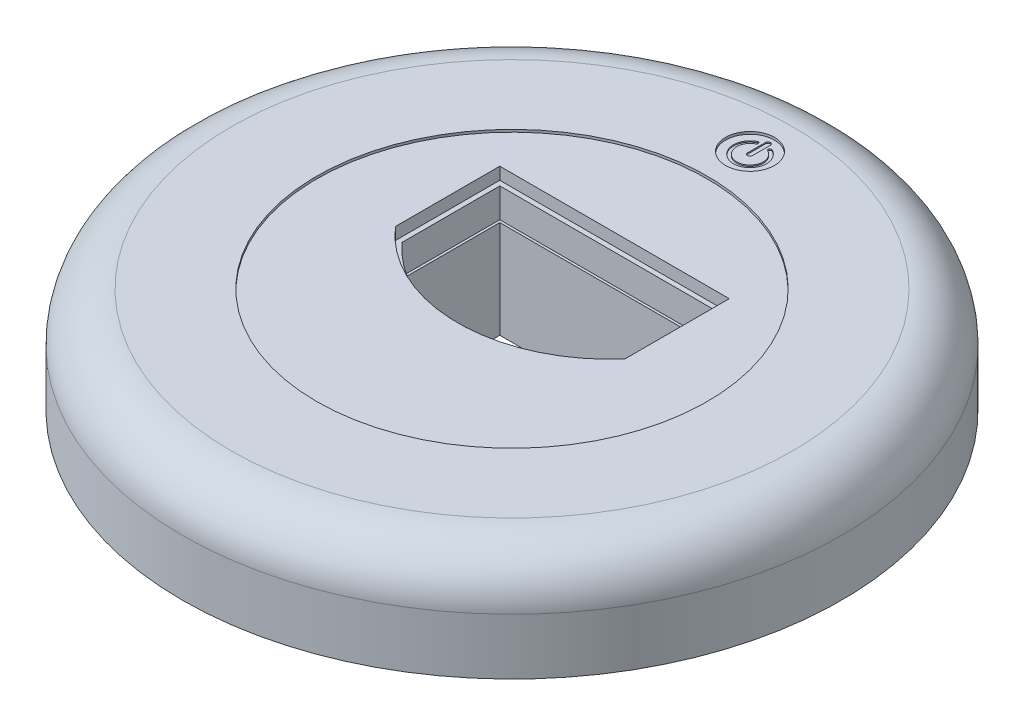
ISO-10303-21;
HEADER;
FILE_DESCRIPTION(('STEP AP214'),'2;1');
FILE_NAME('part.step','',(''),(''),'','','');
FILE_SCHEMA(('AUTOMOTIVE_DESIGN { 1 0 10303 214 1 1 1 1 }'));
ENDSEC;
DATA;
#1=APPLICATION_CONTEXT('core data for automotive mechanical design processes');
#2=APPLICATION_PROTOCOL_DEFINITION('international standard','automotive_design',2000,#1);
#3=PRODUCT_CONTEXT('',#1,'mechanical');
#4=PRODUCT('Part','Part','',(#3));
#5=PRODUCT_RELATED_PRODUCT_CATEGORY('part','',(#4));
#6=PRODUCT_DEFINITION_FORMATION('','',#4);
#7=PRODUCT_DEFINITION_CONTEXT('part definition',#1,'design');
#8=PRODUCT_DEFINITION('design','',#6,#7);
#9=PRODUCT_DEFINITION_SHAPE('','',#8);
#10=(LENGTH_UNIT() NAMED_UNIT(*) SI_UNIT(.MILLI.,.METRE.));
#11=(NAMED_UNIT(*) PLANE_ANGLE_UNIT() SI_UNIT($,.RADIAN.));
#12=(NAMED_UNIT(*) SI_UNIT($,.STERADIAN.) SOLID_ANGLE_UNIT());
#13=UNCERTAINTY_MEASURE_WITH_UNIT(LENGTH_MEASURE(1.E-05),#10,'distance_accuracy_value','');
#14=(GEOMETRIC_REPRESENTATION_CONTEXT(3) GLOBAL_UNCERTAINTY_ASSIGNED_CONTEXT((#13)) GLOBAL_UNIT_ASSIGNED_CONTEXT((#10,
#11,#12)) REPRESENTATION_CONTEXT('',''));
#15=CARTESIAN_POINT('',(0.,0.,0.));
#16=DIRECTION('',(0.,0.,1.));
#17=DIRECTION('',(1.,0.,0.));
#18=AXIS2_PLACEMENT_3D('',#15,#16,#17);
#19=CARTESIAN_POINT('',(-45.,-25.,0.));
#20=DIRECTION('',(1.,0.,0.));
#21=DIRECTION('',(0.,0.,-1.));
#22=AXIS2_PLACEMENT_3D('',#19,#20,#21);
#23=PLANE('',#22);
#24=DIRECTION('',(0.,1.,0.));
#25=VECTOR('',#24,1.);
#26=CARTESIAN_POINT('',(-45.,-25.,-40.));
#27=LINE('',#26,#25);
#28=CARTESIAN_POINT('',(-45.,25.,-40.));
#29=VERTEX_POINT('',#28);
#30=CARTESIAN_POINT('',(-45.,37.,-40.));
#31=VERTEX_POINT('',#30);
#32=EDGE_CURVE('E289',#29,#31,#27,.T.);
#33=ORIENTED_EDGE('',*,*,#32,.T.);
#34=DIRECTION('',(0.,0.,1.));
#35=VECTOR('',#34,1.);
#36=CARTESIAN_POINT('',(-45.,37.,-40.));
#37=LINE('',#36,#35);
#38=CARTESIAN_POINT('',(-45.,37.,0.));
#39=VERTEX_POINT('',#38);
#40=EDGE_CURVE('E271',#31,#39,#37,.T.);
#41=ORIENTED_EDGE('',*,*,#40,.T.);
#42=DIRECTION('',(0.,1.,0.));
#43=VECTOR('',#42,1.);
#44=CARTESIAN_POINT('',(-45.,-25.,0.));
#45=LINE('',#44,#43);
#46=CARTESIAN_POINT('',(-45.,25.,0.));
#47=VERTEX_POINT('',#46);
#48=EDGE_CURVE('E293',#47,#39,#45,.T.);
#49=ORIENTED_EDGE('',*,*,#48,.F.);
#50=DIRECTION('',(0.,0.,-1.));
#51=VECTOR('',#50,1.);
#52=CARTESIAN_POINT('',(-45.,25.,-40.));
#53=LINE('',#52,#51);
#54=EDGE_CURVE('E936',#47,#29,#53,.T.);
#55=ORIENTED_EDGE('',*,*,#54,.T.);
#56=EDGE_LOOP('',(#33,#41,#49,#55));
#57=FACE_BOUND('',#56,.T.);
#58=ADVANCED_FACE('F84',(#57),#23,.T.);
#59=CARTESIAN_POINT('',(0.,-25.,-40.));
#60=DIRECTION('',(0.,0.,1.));
#61=DIRECTION('',(1.,0.,0.));
#62=AXIS2_PLACEMENT_3D('',#59,#60,#61);
#63=PLANE('',#62);
#64=DIRECTION('',(0.,1.,0.));
#65=VECTOR('',#64,1.);
#66=CARTESIAN_POINT('',(45.,-25.,-40.));
#67=LINE('',#66,#65);
#68=CARTESIAN_POINT('',(45.,25.,-40.));
#69=VERTEX_POINT('',#68);
#70=CARTESIAN_POINT('',(45.,37.,-40.));
#71=VERTEX_POINT('',#70);
#72=EDGE_CURVE('E282',#69,#71,#67,.T.);
#73=ORIENTED_EDGE('',*,*,#72,.T.);
#74=DIRECTION('',(-1.,0.,0.));
#75=VECTOR('',#74,1.);
#76=CARTESIAN_POINT('',(45.,37.,-40.));
#77=LINE('',#76,#75);
#78=EDGE_CURVE('E267',#71,#31,#77,.T.);
#79=ORIENTED_EDGE('',*,*,#78,.T.);
#80=ORIENTED_EDGE('',*,*,#32,.F.);
#81=DIRECTION('',(1.,0.,0.));
#82=VECTOR('',#81,1.);
#83=CARTESIAN_POINT('',(45.,25.,-40.));
#84=LINE('',#83,#82);
#85=EDGE_CURVE('E288',#29,#69,#84,.T.);
#86=ORIENTED_EDGE('',*,*,#85,.T.);
#87=EDGE_LOOP('',(#73,#79,#80,#86));
#88=FACE_BOUND('',#87,.T.);
#89=ADVANCED_FACE('F286',(#88),#63,.T.);
#90=CARTESIAN_POINT('',(45.,-25.,0.));
#91=DIRECTION('',(-1.,0.,0.));
#92=DIRECTION('',(0.,0.,1.));
#93=AXIS2_PLACEMENT_3D('',#90,#91,#92);
#94=PLANE('',#93);
#95=DIRECTION('',(0.,1.,0.));
#96=VECTOR('',#95,1.);
#97=CARTESIAN_POINT('',(45.,-25.,0.));
#98=LINE('',#97,#96);
#99=CARTESIAN_POINT('',(45.,25.,0.));
#100=VERTEX_POINT('',#99);
#101=CARTESIAN_POINT('',(45.,37.,0.));
#102=VERTEX_POINT('',#101);
#103=EDGE_CURVE('E284',#100,#102,#98,.T.);
#104=ORIENTED_EDGE('',*,*,#103,.T.);
#105=DIRECTION('',(0.,0.,-1.));
#106=VECTOR('',#105,1.);
#107=CARTESIAN_POINT('',(45.,37.,0.));
#108=LINE('',#107,#106);
#109=EDGE_CURVE('E99',#102,#71,#108,.T.);
#110=ORIENTED_EDGE('',*,*,#109,.T.);
#111=ORIENTED_EDGE('',*,*,#72,.F.);
#112=DIRECTION('',(0.,0.,1.));
#113=VECTOR('',#112,1.);
#114=CARTESIAN_POINT('',(45.,25.,-40.));
#115=LINE('',#114,#113);
#116=EDGE_CURVE('E940',#69,#100,#115,.T.);
#117=ORIENTED_EDGE('',*,*,#116,.T.);
#118=EDGE_LOOP('',(#104,#110,#111,#117));
#119=FACE_BOUND('',#118,.T.);
#120=ADVANCED_FACE('F280',(#119),#94,.T.);
#121=CARTESIAN_POINT('',(0.,-25.,-40.));
#122=DIRECTION('',(0.,1.,0.));
#123=DIRECTION('',(0.,0.,1.));
#124=AXIS2_PLACEMENT_3D('',#121,#122,#123);
#125=CYLINDRICAL_SURFACE('',#124,60.2079728939615);
#126=CARTESIAN_POINT('',(0.,37.,-40.));
#127=DIRECTION('',(0.,1.,0.));
#128=DIRECTION('',(0.,0.,1.));
#129=AXIS2_PLACEMENT_3D('',#126,#127,#128);
#130=CIRCLE('',#129,60.2079728939615);
#131=EDGE_CURVE('E1000',#39,#102,#130,.T.);
#132=ORIENTED_EDGE('',*,*,#131,.T.);
#133=ORIENTED_EDGE('',*,*,#103,.F.);
#134=CARTESIAN_POINT('',(0.,25.,-40.));
#135=DIRECTION('',(0.,-1.,0.));
#136=DIRECTION('',(0.,0.,-1.));
#137=AXIS2_PLACEMENT_3D('',#134,#135,#136);
#138=CIRCLE('',#137,60.2079728939615);
#139=EDGE_CURVE('E938',#100,#47,#138,.T.);
#140=ORIENTED_EDGE('',*,*,#139,.T.);
#141=ORIENTED_EDGE('',*,*,#48,.T.);
#142=EDGE_LOOP('',(#132,#133,#140,#141));
#143=FACE_BOUND('',#142,.T.);
#144=ADVANCED_FACE('F350',(#143),#125,.F.);
#145=CARTESIAN_POINT('',(0.,25.,0.));
#146=DIRECTION('',(0.,-1.,0.));
#147=DIRECTION('',(0.,0.,-1.));
#148=AXIS2_PLACEMENT_3D('',#145,#146,#147);
#149=PLANE('',#148);
#150=CARTESIAN_POINT('',(0.,25.,0.));
#151=DIRECTION('',(0.,-1.,0.));
#152=DIRECTION('',(0.,0.,-1.));
#153=AXIS2_PLACEMENT_3D('',#150,#151,#152);
#154=CIRCLE('',#153,108.);
#155=CARTESIAN_POINT('',(0.,25.,-108.));
#156=VERTEX_POINT('',#155);
#157=EDGE_CURVE('E12',#156,#156,#154,.T.);
#158=ORIENTED_EDGE('',*,*,#157,.T.);
#159=EDGE_LOOP('',(#158));
#160=FACE_BOUND('',#159,.T.);
#161=CARTESIAN_POINT('',(0.,25.,-40.));
#162=DIRECTION('',(0.,-1.,0.));
#163=DIRECTION('',(0.,0.,-1.));
#164=AXIS2_PLACEMENT_3D('',#161,#162,#163);
#165=CIRCLE('',#164,62.2079728939615);
#166=CARTESIAN_POINT('',(47.,25.,0.753305284060678));
#167=VERTEX_POINT('',#166);
#168=CARTESIAN_POINT('',(-47.,25.,0.753305284060651));
#169=VERTEX_POINT('',#168);
#170=EDGE_CURVE('E372',#167,#169,#165,.T.);
#171=ORIENTED_EDGE('',*,*,#170,.F.);
#172=DIRECTION('',(0.,0.,1.));
#173=VECTOR('',#172,1.);
#174=CARTESIAN_POINT('',(47.,25.,0.));
#175=LINE('',#174,#173);
#176=CARTESIAN_POINT('',(47.,25.,-42.));
#177=VERTEX_POINT('',#176);
#178=EDGE_CURVE('E375',#177,#167,#175,.T.);
#179=ORIENTED_EDGE('',*,*,#178,.F.);
#180=DIRECTION('',(1.,0.,0.));
#181=VECTOR('',#180,1.);
#182=CARTESIAN_POINT('',(0.,25.,-42.));
#183=LINE('',#182,#181);
#184=CARTESIAN_POINT('',(-47.,25.,-42.));
#185=VERTEX_POINT('',#184);
#186=EDGE_CURVE('E382',#185,#177,#183,.T.);
#187=ORIENTED_EDGE('',*,*,#186,.F.);
#188=DIRECTION('',(0.,0.,-1.));
#189=VECTOR('',#188,1.);
#190=CARTESIAN_POINT('',(-47.,25.,0.));
#191=LINE('',#190,#189);
#192=EDGE_CURVE('E377',#169,#185,#191,.T.);
#193=ORIENTED_EDGE('',*,*,#192,.F.);
#194=EDGE_LOOP('',(#171,#179,#187,#193));
#195=FACE_BOUND('',#194,.T.);
#196=ADVANCED_FACE('F354',(#160,#195),#149,.T.);
#197=CARTESIAN_POINT('',(0.,42.,0.));
#198=DIRECTION('',(0.,1.,0.));
#199=DIRECTION('',(0.,0.,1.));
#200=AXIS2_PLACEMENT_3D('',#197,#198,#199);
#201=PLANE('',#200);
#202=DIRECTION('',(-1.,0.,0.));
#203=VECTOR('',#202,1.);
#204=CARTESIAN_POINT('',(47.,42.,-42.));
#205=LINE('',#204,#203);
#206=CARTESIAN_POINT('',(47.,42.,-42.));
#207=VERTEX_POINT('',#206);
#208=CARTESIAN_POINT('',(-47.,42.,-42.));
#209=VERTEX_POINT('',#208);
#210=EDGE_CURVE('E107',#207,#209,#205,.T.);
#211=ORIENTED_EDGE('',*,*,#210,.F.);
#212=DIRECTION('',(0.,0.,-1.));
#213=VECTOR('',#212,1.);
#214=CARTESIAN_POINT('',(47.,42.,0.753305284060645));
#215=LINE('',#214,#213);
#216=CARTESIAN_POINT('',(47.,42.,0.753305284060632));
#217=VERTEX_POINT('',#216);
#218=EDGE_CURVE('E989',#217,#207,#215,.T.);
#219=ORIENTED_EDGE('',*,*,#218,.F.);
#220=CARTESIAN_POINT('',(0.,42.,-40.));
#221=DIRECTION('',(0.,1.,0.));
#222=DIRECTION('',(0.,0.,1.));
#223=AXIS2_PLACEMENT_3D('',#220,#221,#222);
#224=CIRCLE('',#223,62.2079728939615);
#225=CARTESIAN_POINT('',(-47.,42.,0.753305284060672));
#226=VERTEX_POINT('',#225);
#227=EDGE_CURVE('E993',#226,#217,#224,.T.);
#228=ORIENTED_EDGE('',*,*,#227,.F.);
#229=DIRECTION('',(0.,0.,1.));
#230=VECTOR('',#229,1.);
#231=CARTESIAN_POINT('',(-47.,42.,-42.));
#232=LINE('',#231,#230);
#233=EDGE_CURVE('E996',#209,#226,#232,.T.);
#234=ORIENTED_EDGE('',*,*,#233,.F.);
#235=EDGE_LOOP('',(#211,#219,#228,#234));
#236=FACE_BOUND('',#235,.T.);
#237=CARTESIAN_POINT('',(0.,42.,0.));
#238=DIRECTION('',(0.,1.,0.));
#239=DIRECTION('',(0.,0.,1.));
#240=AXIS2_PLACEMENT_3D('',#237,#238,#239);
#241=CIRCLE('',#240,80.);
#242=CARTESIAN_POINT('',(0.,42.,80.));
#243=VERTEX_POINT('',#242);
#244=EDGE_CURVE('E300',#243,#243,#241,.T.);
#245=ORIENTED_EDGE('',*,*,#244,.T.);
#246=EDGE_LOOP('',(#245));
#247=FACE_BOUND('',#246,.T.);
#248=ADVANCED_FACE('F335',(#236,#247),#201,.T.);
#249=CARTESIAN_POINT('',(0.,43.,0.));
#250=DIRECTION('',(0.,-1.,0.));
#251=DIRECTION('',(0.,0.,-1.));
#252=AXIS2_PLACEMENT_3D('',#249,#250,#251);
#253=CYLINDRICAL_SURFACE('',#252,135.);
#254=CARTESIAN_POINT('',(0.,23.,0.));
#255=DIRECTION('',(0.,1.,0.));
#256=DIRECTION('',(0.,0.,1.));
#257=AXIS2_PLACEMENT_3D('',#254,#255,#256);
#258=CIRCLE('',#257,135.);
#259=CARTESIAN_POINT('',(0.,23.,135.));
#260=VERTEX_POINT('',#259);
#261=EDGE_CURVE('E92',#260,#260,#258,.F.);
#262=ORIENTED_EDGE('',*,*,#261,.T.);
#263=EDGE_LOOP('',(#262));
#264=FACE_BOUND('',#263,.T.);
#265=CARTESIAN_POINT('',(0.,0.,0.));
#266=DIRECTION('',(0.,1.,0.));
#267=DIRECTION('',(0.,0.,1.));
#268=AXIS2_PLACEMENT_3D('',#265,#266,#267);
#269=CIRCLE('',#268,135.);
#270=CARTESIAN_POINT('',(0.,0.,135.));
#271=VERTEX_POINT('',#270);
#272=EDGE_CURVE('E308',#271,#271,#269,.T.);
#273=ORIENTED_EDGE('',*,*,#272,.T.);
#274=EDGE_LOOP('',(#273));
#275=FACE_BOUND('',#274,.T.);
#276=ADVANCED_FACE('F316',(#264,#275),#253,.T.);
#277=CARTESIAN_POINT('',(0.,43.,0.));
#278=DIRECTION('',(0.,1.,0.));
#279=DIRECTION('',(0.,0.,1.));
#280=AXIS2_PLACEMENT_3D('',#277,#278,#279);
#281=PLANE('',#280);
#282=CARTESIAN_POINT('',(0.,43.,-97.5));
#283=DIRECTION('',(0.,1.,0.));
#284=DIRECTION('',(0.,0.,1.));
#285=AXIS2_PLACEMENT_3D('',#282,#283,#284);
#286=CIRCLE('',#285,10.);
#287=CARTESIAN_POINT('',(0.,43.,-87.5));
#288=VERTEX_POINT('',#287);
#289=EDGE_CURVE('E457',#288,#288,#286,.T.);
#290=ORIENTED_EDGE('',*,*,#289,.F.);
#291=EDGE_LOOP('',(#290));
#292=FACE_BOUND('',#291,.T.);
#293=CARTESIAN_POINT('',(0.,43.,0.));
#294=DIRECTION('',(0.,1.,0.));
#295=DIRECTION('',(0.,0.,1.));
#296=AXIS2_PLACEMENT_3D('',#293,#294,#295);
#297=CIRCLE('',#296,80.);
#298=CARTESIAN_POINT('',(0.,43.,80.));
#299=VERTEX_POINT('',#298);
#300=EDGE_CURVE('E291',#299,#299,#297,.T.);
#301=ORIENTED_EDGE('',*,*,#300,.F.);
#302=EDGE_LOOP('',(#301));
#303=FACE_BOUND('',#302,.T.);
#304=CARTESIAN_POINT('',(0.,43.,0.));
#305=DIRECTION('',(0.,1.,0.));
#306=DIRECTION('',(0.,0.,1.));
#307=AXIS2_PLACEMENT_3D('',#304,#305,#306);
#308=CIRCLE('',#307,115.);
#309=CARTESIAN_POINT('',(0.,43.,115.));
#310=VERTEX_POINT('',#309);
#311=EDGE_CURVE('E311',#310,#310,#308,.T.);
#312=ORIENTED_EDGE('',*,*,#311,.T.);
#313=EDGE_LOOP('',(#312));
#314=FACE_BOUND('',#313,.T.);
#315=ADVANCED_FACE('F325',(#292,#303,#314),#281,.T.);
#316=CARTESIAN_POINT('',(0.,0.,0.));
#317=DIRECTION('',(0.,1.,0.));
#318=DIRECTION('',(0.,0.,1.));
#319=AXIS2_PLACEMENT_3D('',#316,#317,#318);
#320=PLANE('',#319);
#321=CARTESIAN_POINT('',(0.,0.,0.));
#322=DIRECTION('',(0.,-1.,0.));
#323=DIRECTION('',(0.,0.,-1.));
#324=AXIS2_PLACEMENT_3D('',#321,#322,#323);
#325=CIRCLE('',#324,133.);
#326=CARTESIAN_POINT('',(0.,0.,-133.));
#327=VERTEX_POINT('',#326);
#328=EDGE_CURVE('E303',#327,#327,#325,.T.);
#329=ORIENTED_EDGE('',*,*,#328,.F.);
#330=EDGE_LOOP('',(#329));
#331=FACE_BOUND('',#330,.T.);
#332=ORIENTED_EDGE('',*,*,#272,.F.);
#333=EDGE_LOOP('',(#332));
#334=FACE_BOUND('',#333,.T.);
#335=ADVANCED_FACE('F322',(#331,#334),#320,.F.);
#336=CARTESIAN_POINT('',(0.,23.,0.));
#337=DIRECTION('',(0.,1.,0.));
#338=DIRECTION('',(0.,0.,1.));
#339=AXIS2_PLACEMENT_3D('',#336,#337,#338);
#340=TOROIDAL_SURFACE('',#339,115.,20.);
#341=ORIENTED_EDGE('',*,*,#261,.F.);
#342=EDGE_LOOP('',(#341));
#343=FACE_BOUND('',#342,.T.);
#344=ORIENTED_EDGE('',*,*,#311,.F.);
#345=EDGE_LOOP('',(#344));
#346=FACE_BOUND('',#345,.T.);
#347=ADVANCED_FACE('F319',(#343,#346),#340,.T.);
#348=CARTESIAN_POINT('',(0.,0.,0.));
#349=DIRECTION('',(0.,-1.,0.));
#350=DIRECTION('',(0.,0.,-1.));
#351=AXIS2_PLACEMENT_3D('',#348,#349,#350);
#352=TOROIDAL_SURFACE('',#351,108.,25.);
#353=ORIENTED_EDGE('',*,*,#328,.T.);
#354=EDGE_LOOP('',(#353));
#355=FACE_BOUND('',#354,.T.);
#356=ORIENTED_EDGE('',*,*,#157,.F.);
#357=EDGE_LOOP('',(#356));
#358=FACE_BOUND('',#357,.T.);
#359=ADVANCED_FACE('F86',(#355,#358),#352,.F.);
#360=CARTESIAN_POINT('',(0.,42.,0.));
#361=DIRECTION('',(0.,1.,0.));
#362=DIRECTION('',(0.,0.,1.));
#363=AXIS2_PLACEMENT_3D('',#360,#361,#362);
#364=CYLINDRICAL_SURFACE('',#363,80.);
#365=ORIENTED_EDGE('',*,*,#244,.F.);
#366=EDGE_LOOP('',(#365));
#367=FACE_BOUND('',#366,.T.);
#368=ORIENTED_EDGE('',*,*,#300,.T.);
#369=EDGE_LOOP('',(#368));
#370=FACE_BOUND('',#369,.T.);
#371=ADVANCED_FACE('F356',(#367,#370),#364,.F.);
#372=CARTESIAN_POINT('',(0.,42.,-97.5));
#373=DIRECTION('',(0.,1.,0.));
#374=DIRECTION('',(0.,0.,1.));
#375=AXIS2_PLACEMENT_3D('',#372,#373,#374);
#376=CYLINDRICAL_SURFACE('',#375,10.);
#377=CARTESIAN_POINT('',(0.,42.,-97.5));
#378=DIRECTION('',(0.,1.,0.));
#379=DIRECTION('',(0.,0.,1.));
#380=AXIS2_PLACEMENT_3D('',#377,#378,#379);
#381=CIRCLE('',#380,10.);
#382=CARTESIAN_POINT('',(0.,42.,-87.5));
#383=VERTEX_POINT('',#382);
#384=EDGE_CURVE('E299',#383,#383,#381,.T.);
#385=ORIENTED_EDGE('',*,*,#384,.F.);
#386=EDGE_LOOP('',(#385));
#387=FACE_BOUND('',#386,.T.);
#388=ORIENTED_EDGE('',*,*,#289,.T.);
#389=EDGE_LOOP('',(#388));
#390=FACE_BOUND('',#389,.T.);
#391=ADVANCED_FACE('F358',(#387,#390),#376,.F.);
#392=CARTESIAN_POINT('',(0.,42.,-97.5));
#393=DIRECTION('',(0.,1.,0.));
#394=DIRECTION('',(0.,0.,1.));
#395=AXIS2_PLACEMENT_3D('',#392,#393,#394);
#396=PLANE('',#395);
#397=DIRECTION('',(0.,0.,-1.));
#398=VECTOR('',#397,1.);
#399=CARTESIAN_POINT('',(1.,42.,-97.5));
#400=LINE('',#399,#398);
#401=CARTESIAN_POINT('',(1.,42.,-97.5));
#402=VERTEX_POINT('',#401);
#403=CARTESIAN_POINT('',(1.,42.,-104.846686009449));
#404=VERTEX_POINT('',#403);
#405=EDGE_CURVE('E422',#402,#404,#400,.T.);
#406=ORIENTED_EDGE('',*,*,#405,.F.);
#407=CARTESIAN_POINT('',(0.,42.,-97.5));
#408=DIRECTION('',(0.,1.,0.));
#409=DIRECTION('',(0.,0.,1.));
#410=AXIS2_PLACEMENT_3D('',#407,#408,#409);
#411=CIRCLE('',#410,1.);
#412=CARTESIAN_POINT('',(-1.,42.,-97.5));
#413=VERTEX_POINT('',#412);
#414=EDGE_CURVE('E436',#413,#402,#411,.T.);
#415=ORIENTED_EDGE('',*,*,#414,.F.);
#416=DIRECTION('',(0.,0.,-1.));
#417=VECTOR('',#416,1.);
#418=CARTESIAN_POINT('',(-1.,42.,-97.5));
#419=LINE('',#418,#417);
#420=CARTESIAN_POINT('',(-1.,42.,-104.846686009449));
#421=VERTEX_POINT('',#420);
#422=EDGE_CURVE('E450',#413,#421,#419,.T.);
#423=ORIENTED_EDGE('',*,*,#422,.T.);
#424=CARTESIAN_POINT('',(0.,42.,-104.846686009449));
#425=DIRECTION('',(0.,1.,0.));
#426=DIRECTION('',(0.,0.,1.));
#427=AXIS2_PLACEMENT_3D('',#424,#425,#426);
#428=CIRCLE('',#427,1.);
#429=EDGE_CURVE('E447',#404,#421,#428,.T.);
#430=ORIENTED_EDGE('',*,*,#429,.F.);
#431=EDGE_LOOP('',(#406,#415,#423,#430));
#432=FACE_BOUND('',#431,.T.);
#433=CARTESIAN_POINT('',(-2.72802754622821,42.,-102.947635230813));
#434=DIRECTION('',(0.,1.,0.));
#435=DIRECTION('',(0.,0.,1.));
#436=AXIS2_PLACEMENT_3D('',#433,#434,#435);
#437=CIRCLE('',#436,0.66439805051304);
#438=CARTESIAN_POINT('',(-2.43053248308169,42.,-102.353563301726));
#439=VERTEX_POINT('',#438);
#440=CARTESIAN_POINT('',(-3.02552260937474,42.,-103.541707159899));
#441=VERTEX_POINT('',#440);
#442=EDGE_CURVE('E420',#439,#441,#437,.T.);
#443=ORIENTED_EDGE('',*,*,#442,.F.);
#444=CARTESIAN_POINT('',(0.,42.,-97.5));
#445=DIRECTION('',(0.,1.,0.));
#446=DIRECTION('',(0.,0.,1.));
#447=AXIS2_PLACEMENT_3D('',#444,#445,#446);
#448=CIRCLE('',#447,5.42812719777039);
#449=CARTESIAN_POINT('',(2.34913777757174,42.,-102.393476941517));
#450=VERTEX_POINT('',#449);
#451=EDGE_CURVE('E410',#439,#450,#448,.T.);
#452=ORIENTED_EDGE('',*,*,#451,.T.);
#453=CARTESIAN_POINT('',(2.63667019951762,42.,-102.992434265419));
#454=DIRECTION('',(0.,1.,0.));
#455=DIRECTION('',(0.,0.,1.));
#456=AXIS2_PLACEMENT_3D('',#453,#454,#455);
#457=CIRCLE('',#456,0.664398050513037);
#458=CARTESIAN_POINT('',(2.92420262146349,42.,-103.59139158932));
#459=VERTEX_POINT('',#458);
#460=EDGE_CURVE('E413',#459,#450,#457,.T.);
#461=ORIENTED_EDGE('',*,*,#460,.F.);
#462=CARTESIAN_POINT('',(0.,42.,-97.5));
#463=DIRECTION('',(0.,1.,0.));
#464=DIRECTION('',(0.,0.,1.));
#465=AXIS2_PLACEMENT_3D('',#462,#463,#464);
#466=CIRCLE('',#465,6.75692329879646);
#467=EDGE_CURVE('E417',#441,#459,#466,.T.);
#468=ORIENTED_EDGE('',*,*,#467,.F.);
#469=EDGE_LOOP('',(#443,#452,#461,#468));
#470=FACE_BOUND('',#469,.T.);
#471=ORIENTED_EDGE('',*,*,#384,.T.);
#472=EDGE_LOOP('',(#471));
#473=FACE_BOUND('',#472,.T.);
#474=ADVANCED_FACE('F468',(#432,#470,#473),#396,.T.);
#475=CARTESIAN_POINT('',(-2.72802754622821,41.5,-102.947635230813));
#476=DIRECTION('',(0.,1.,0.));
#477=DIRECTION('',(0.,0.,1.));
#478=AXIS2_PLACEMENT_3D('',#475,#476,#477);
#479=CYLINDRICAL_SURFACE('',#478,0.66439805051304);
#480=ORIENTED_EDGE('',*,*,#442,.T.);
#481=DIRECTION('',(0.,1.,0.));
#482=VECTOR('',#481,1.);
#483=CARTESIAN_POINT('',(-3.02552260937474,41.5,-103.541707159899));
#484=LINE('',#483,#482);
#485=CARTESIAN_POINT('',(-3.02552260937474,41.5,-103.541707159899));
#486=VERTEX_POINT('',#485);
#487=EDGE_CURVE('E401',#486,#441,#484,.T.);
#488=ORIENTED_EDGE('',*,*,#487,.F.);
#489=CARTESIAN_POINT('',(-2.72802754622821,41.5,-102.947635230813));
#490=DIRECTION('',(0.,1.,0.));
#491=DIRECTION('',(0.,0.,1.));
#492=AXIS2_PLACEMENT_3D('',#489,#490,#491);
#493=CIRCLE('',#492,0.66439805051304);
#494=CARTESIAN_POINT('',(-2.43053248308169,41.5,-102.353563301726));
#495=VERTEX_POINT('',#494);
#496=EDGE_CURVE('E414',#495,#486,#493,.T.);
#497=ORIENTED_EDGE('',*,*,#496,.F.);
#498=DIRECTION('',(0.,1.,0.));
#499=VECTOR('',#498,1.);
#500=CARTESIAN_POINT('',(-2.43053248308169,41.5,-102.353563301726));
#501=LINE('',#500,#499);
#502=EDGE_CURVE('E400',#495,#439,#501,.T.);
#503=ORIENTED_EDGE('',*,*,#502,.T.);
#504=EDGE_LOOP('',(#480,#488,#497,#503));
#505=FACE_BOUND('',#504,.T.);
#506=ADVANCED_FACE('F474',(#505),#479,.F.);
#507=CARTESIAN_POINT('',(0.,41.5,-97.5));
#508=DIRECTION('',(0.,1.,0.));
#509=DIRECTION('',(0.,0.,1.));
#510=AXIS2_PLACEMENT_3D('',#507,#508,#509);
#511=CYLINDRICAL_SURFACE('',#510,5.42812719777039);
#512=ORIENTED_EDGE('',*,*,#451,.F.);
#513=ORIENTED_EDGE('',*,*,#502,.F.);
#514=CARTESIAN_POINT('',(0.,41.5,-97.5));
#515=DIRECTION('',(0.,1.,0.));
#516=DIRECTION('',(0.,0.,1.));
#517=AXIS2_PLACEMENT_3D('',#514,#515,#516);
#518=CIRCLE('',#517,5.42812719777039);
#519=CARTESIAN_POINT('',(2.34913777757174,41.5,-102.393476941517));
#520=VERTEX_POINT('',#519);
#521=EDGE_CURVE('E404',#495,#520,#518,.T.);
#522=ORIENTED_EDGE('',*,*,#521,.T.);
#523=DIRECTION('',(0.,1.,0.));
#524=VECTOR('',#523,1.);
#525=CARTESIAN_POINT('',(2.34913777757174,41.5,-102.393476941517));
#526=LINE('',#525,#524);
#527=EDGE_CURVE('E407',#520,#450,#526,.T.);
#528=ORIENTED_EDGE('',*,*,#527,.T.);
#529=EDGE_LOOP('',(#512,#513,#522,#528));
#530=FACE_BOUND('',#529,.T.);
#531=ADVANCED_FACE('F608',(#530),#511,.T.);
#532=CARTESIAN_POINT('',(2.63667019951762,41.5,-102.992434265419));
#533=DIRECTION('',(0.,1.,0.));
#534=DIRECTION('',(0.,0.,1.));
#535=AXIS2_PLACEMENT_3D('',#532,#533,#534);
#536=CYLINDRICAL_SURFACE('',#535,0.664398050513037);
#537=ORIENTED_EDGE('',*,*,#460,.T.);
#538=ORIENTED_EDGE('',*,*,#527,.F.);
#539=CARTESIAN_POINT('',(2.63667019951762,41.5,-102.992434265419));
#540=DIRECTION('',(0.,1.,0.));
#541=DIRECTION('',(0.,0.,1.));
#542=AXIS2_PLACEMENT_3D('',#539,#540,#541);
#543=CIRCLE('',#542,0.664398050513037);
#544=CARTESIAN_POINT('',(2.92420262146349,41.5,-103.59139158932));
#545=VERTEX_POINT('',#544);
#546=EDGE_CURVE('E424',#545,#520,#543,.T.);
#547=ORIENTED_EDGE('',*,*,#546,.F.);
#548=DIRECTION('',(0.,1.,0.));
#549=VECTOR('',#548,1.);
#550=CARTESIAN_POINT('',(2.92420262146349,41.5,-103.59139158932));
#551=LINE('',#550,#549);
#552=EDGE_CURVE('E405',#545,#459,#551,.T.);
#553=ORIENTED_EDGE('',*,*,#552,.T.);
#554=EDGE_LOOP('',(#537,#538,#547,#553));
#555=FACE_BOUND('',#554,.T.);
#556=ADVANCED_FACE('F614',(#555),#536,.F.);
#557=CARTESIAN_POINT('',(0.,41.5,-97.5));
#558=DIRECTION('',(0.,1.,0.));
#559=DIRECTION('',(0.,0.,1.));
#560=AXIS2_PLACEMENT_3D('',#557,#558,#559);
#561=CYLINDRICAL_SURFACE('',#560,6.75692329879646);
#562=ORIENTED_EDGE('',*,*,#467,.T.);
#563=ORIENTED_EDGE('',*,*,#552,.F.);
#564=CARTESIAN_POINT('',(0.,41.5,-97.5));
#565=DIRECTION('',(0.,1.,0.));
#566=DIRECTION('',(0.,0.,1.));
#567=AXIS2_PLACEMENT_3D('',#564,#565,#566);
#568=CIRCLE('',#567,6.75692329879646);
#569=EDGE_CURVE('E427',#486,#545,#568,.T.);
#570=ORIENTED_EDGE('',*,*,#569,.F.);
#571=ORIENTED_EDGE('',*,*,#487,.T.);
#572=EDGE_LOOP('',(#562,#563,#570,#571));
#573=FACE_BOUND('',#572,.T.);
#574=ADVANCED_FACE('F610',(#573),#561,.F.);
#575=CARTESIAN_POINT('',(-1.36401377311411,41.5,-100.223817615406));
#576=DIRECTION('',(0.,1.,0.));
#577=DIRECTION('',(0.,0.,1.));
#578=AXIS2_PLACEMENT_3D('',#575,#576,#577);
#579=PLANE('',#578);
#580=ORIENTED_EDGE('',*,*,#496,.T.);
#581=ORIENTED_EDGE('',*,*,#569,.T.);
#582=ORIENTED_EDGE('',*,*,#546,.T.);
#583=ORIENTED_EDGE('',*,*,#521,.F.);
#584=EDGE_LOOP('',(#580,#581,#582,#583));
#585=FACE_BOUND('',#584,.T.);
#586=ADVANCED_FACE('F613',(#585),#579,.T.);
#587=CARTESIAN_POINT('',(1.,41.5,-97.5));
#588=DIRECTION('',(1.,0.,0.));
#589=DIRECTION('',(0.,0.,-1.));
#590=AXIS2_PLACEMENT_3D('',#587,#588,#589);
#591=PLANE('',#590);
#592=ORIENTED_EDGE('',*,*,#405,.T.);
#593=DIRECTION('',(0.,1.,0.));
#594=VECTOR('',#593,1.);
#595=CARTESIAN_POINT('',(1.,41.5,-104.846686009449));
#596=LINE('',#595,#594);
#597=CARTESIAN_POINT('',(1.,41.5,-104.846686009449));
#598=VERTEX_POINT('',#597);
#599=EDGE_CURVE('E444',#598,#404,#596,.T.);
#600=ORIENTED_EDGE('',*,*,#599,.F.);
#601=DIRECTION('',(0.,0.,-1.));
#602=VECTOR('',#601,1.);
#603=CARTESIAN_POINT('',(1.,41.5,-97.5));
#604=LINE('',#603,#602);
#605=CARTESIAN_POINT('',(1.,41.5,-97.5));
#606=VERTEX_POINT('',#605);
#607=EDGE_CURVE('E432',#606,#598,#604,.T.);
#608=ORIENTED_EDGE('',*,*,#607,.F.);
#609=DIRECTION('',(0.,1.,0.));
#610=VECTOR('',#609,1.);
#611=CARTESIAN_POINT('',(1.,41.5,-97.5));
#612=LINE('',#611,#610);
#613=EDGE_CURVE('E455',#606,#402,#612,.T.);
#614=ORIENTED_EDGE('',*,*,#613,.T.);
#615=EDGE_LOOP('',(#592,#600,#608,#614));
#616=FACE_BOUND('',#615,.T.);
#617=ADVANCED_FACE('F624',(#616),#591,.F.);
#618=CARTESIAN_POINT('',(0.,41.5,-97.5));
#619=DIRECTION('',(0.,1.,0.));
#620=DIRECTION('',(0.,0.,1.));
#621=AXIS2_PLACEMENT_3D('',#618,#619,#620);
#622=CYLINDRICAL_SURFACE('',#621,1.);
#623=ORIENTED_EDGE('',*,*,#414,.T.);
#624=ORIENTED_EDGE('',*,*,#613,.F.);
#625=CARTESIAN_POINT('',(0.,41.5,-97.5));
#626=DIRECTION('',(0.,1.,0.));
#627=DIRECTION('',(0.,0.,1.));
#628=AXIS2_PLACEMENT_3D('',#625,#626,#627);
#629=CIRCLE('',#628,1.);
#630=CARTESIAN_POINT('',(-1.,41.5,-97.5));
#631=VERTEX_POINT('',#630);
#632=EDGE_CURVE('E441',#631,#606,#629,.T.);
#633=ORIENTED_EDGE('',*,*,#632,.F.);
#634=DIRECTION('',(0.,1.,0.));
#635=VECTOR('',#634,1.);
#636=CARTESIAN_POINT('',(-1.,41.5,-97.5));
#637=LINE('',#636,#635);
#638=EDGE_CURVE('E458',#631,#413,#637,.T.);
#639=ORIENTED_EDGE('',*,*,#638,.T.);
#640=EDGE_LOOP('',(#623,#624,#633,#639));
#641=FACE_BOUND('',#640,.T.);
#642=ADVANCED_FACE('F630',(#641),#622,.F.);
#643=CARTESIAN_POINT('',(-1.,41.5,-97.5));
#644=DIRECTION('',(1.,0.,0.));
#645=DIRECTION('',(0.,0.,-1.));
#646=AXIS2_PLACEMENT_3D('',#643,#644,#645);
#647=PLANE('',#646);
#648=ORIENTED_EDGE('',*,*,#422,.F.);
#649=ORIENTED_EDGE('',*,*,#638,.F.);
#650=DIRECTION('',(0.,0.,-1.));
#651=VECTOR('',#650,1.);
#652=CARTESIAN_POINT('',(-1.,41.5,-97.5));
#653=LINE('',#652,#651);
#654=CARTESIAN_POINT('',(-1.,41.5,-104.846686009449));
#655=VERTEX_POINT('',#654);
#656=EDGE_CURVE('E439',#631,#655,#653,.T.);
#657=ORIENTED_EDGE('',*,*,#656,.T.);
#658=DIRECTION('',(0.,1.,0.));
#659=VECTOR('',#658,1.);
#660=CARTESIAN_POINT('',(-1.,41.5,-104.846686009449));
#661=LINE('',#660,#659);
#662=EDGE_CURVE('E461',#655,#421,#661,.T.);
#663=ORIENTED_EDGE('',*,*,#662,.T.);
#664=EDGE_LOOP('',(#648,#649,#657,#663));
#665=FACE_BOUND('',#664,.T.);
#666=ADVANCED_FACE('F633',(#665),#647,.T.);
#667=CARTESIAN_POINT('',(0.,41.5,-104.846686009449));
#668=DIRECTION('',(0.,1.,0.));
#669=DIRECTION('',(0.,0.,1.));
#670=AXIS2_PLACEMENT_3D('',#667,#668,#669);
#671=CYLINDRICAL_SURFACE('',#670,1.);
#672=ORIENTED_EDGE('',*,*,#429,.T.);
#673=ORIENTED_EDGE('',*,*,#662,.F.);
#674=CARTESIAN_POINT('',(0.,41.5,-104.846686009449));
#675=DIRECTION('',(0.,1.,0.));
#676=DIRECTION('',(0.,0.,1.));
#677=AXIS2_PLACEMENT_3D('',#674,#675,#676);
#678=CIRCLE('',#677,1.);
#679=EDGE_CURVE('E435',#598,#655,#678,.T.);
#680=ORIENTED_EDGE('',*,*,#679,.F.);
#681=ORIENTED_EDGE('',*,*,#599,.T.);
#682=EDGE_LOOP('',(#672,#673,#680,#681));
#683=FACE_BOUND('',#682,.T.);
#684=ADVANCED_FACE('F628',(#683),#671,.F.);
#685=CARTESIAN_POINT('',(0.,41.5,-104.846686009449));
#686=DIRECTION('',(0.,1.,0.));
#687=DIRECTION('',(0.,0.,1.));
#688=AXIS2_PLACEMENT_3D('',#685,#686,#687);
#689=PLANE('',#688);
#690=ORIENTED_EDGE('',*,*,#607,.T.);
#691=ORIENTED_EDGE('',*,*,#679,.T.);
#692=ORIENTED_EDGE('',*,*,#656,.F.);
#693=ORIENTED_EDGE('',*,*,#632,.T.);
#694=EDGE_LOOP('',(#690,#691,#692,#693));
#695=FACE_BOUND('',#694,.T.);
#696=ADVANCED_FACE('F604',(#695),#689,.T.);
#697=CARTESIAN_POINT('',(47.,20.,0.));
#698=DIRECTION('',(-1.,0.,0.));
#699=DIRECTION('',(0.,0.,1.));
#700=AXIS2_PLACEMENT_3D('',#697,#698,#699);
#701=PLANE('',#700);
#702=ORIENTED_EDGE('',*,*,#178,.T.);
#703=DIRECTION('',(0.,1.,0.));
#704=VECTOR('',#703,1.);
#705=CARTESIAN_POINT('',(47.,20.,0.753305284060678));
#706=LINE('',#705,#704);
#707=CARTESIAN_POINT('',(47.,20.,0.753305284060678));
#708=VERTEX_POINT('',#707);
#709=EDGE_CURVE('E398',#708,#167,#706,.T.);
#710=ORIENTED_EDGE('',*,*,#709,.F.);
#711=DIRECTION('',(0.,0.,1.));
#712=VECTOR('',#711,1.);
#713=CARTESIAN_POINT('',(47.,20.,0.));
#714=LINE('',#713,#712);
#715=CARTESIAN_POINT('',(47.,20.,-42.));
#716=VERTEX_POINT('',#715);
#717=EDGE_CURVE('E901',#716,#708,#714,.T.);
#718=ORIENTED_EDGE('',*,*,#717,.F.);
#719=DIRECTION('',(0.,1.,0.));
#720=VECTOR('',#719,1.);
#721=CARTESIAN_POINT('',(47.,20.,-42.));
#722=LINE('',#721,#720);
#723=EDGE_CURVE('E390',#716,#177,#722,.T.);
#724=ORIENTED_EDGE('',*,*,#723,.T.);
#725=EDGE_LOOP('',(#702,#710,#718,#724));
#726=FACE_BOUND('',#725,.T.);
#727=ADVANCED_FACE('F601',(#726),#701,.F.);
#728=CARTESIAN_POINT('',(0.,20.,-40.));
#729=DIRECTION('',(0.,1.,0.));
#730=DIRECTION('',(0.,0.,1.));
#731=AXIS2_PLACEMENT_3D('',#728,#729,#730);
#732=CYLINDRICAL_SURFACE('',#731,62.2079728939615);
#733=ORIENTED_EDGE('',*,*,#170,.T.);
#734=DIRECTION('',(0.,1.,0.));
#735=VECTOR('',#734,1.);
#736=CARTESIAN_POINT('',(-47.,20.,0.753305284060651));
#737=LINE('',#736,#735);
#738=CARTESIAN_POINT('',(-47.,20.,0.753305284060651));
#739=VERTEX_POINT('',#738);
#740=EDGE_CURVE('E396',#739,#169,#737,.T.);
#741=ORIENTED_EDGE('',*,*,#740,.F.);
#742=CARTESIAN_POINT('',(0.,20.,-40.));
#743=DIRECTION('',(0.,-1.,0.));
#744=DIRECTION('',(0.,0.,-1.));
#745=AXIS2_PLACEMENT_3D('',#742,#743,#744);
#746=CIRCLE('',#745,62.2079728939615);
#747=EDGE_CURVE('E906',#708,#739,#746,.T.);
#748=ORIENTED_EDGE('',*,*,#747,.F.);
#749=ORIENTED_EDGE('',*,*,#709,.T.);
#750=EDGE_LOOP('',(#733,#741,#748,#749));
#751=FACE_BOUND('',#750,.T.);
#752=ADVANCED_FACE('F597',(#751),#732,.T.);
#753=CARTESIAN_POINT('',(-47.,20.,0.));
#754=DIRECTION('',(1.,0.,0.));
#755=DIRECTION('',(0.,0.,-1.));
#756=AXIS2_PLACEMENT_3D('',#753,#754,#755);
#757=PLANE('',#756);
#758=ORIENTED_EDGE('',*,*,#192,.T.);
#759=DIRECTION('',(0.,1.,0.));
#760=VECTOR('',#759,1.);
#761=CARTESIAN_POINT('',(-47.,20.,-42.));
#762=LINE('',#761,#760);
#763=CARTESIAN_POINT('',(-47.,20.,-42.));
#764=VERTEX_POINT('',#763);
#765=EDGE_CURVE('E393',#764,#185,#762,.T.);
#766=ORIENTED_EDGE('',*,*,#765,.F.);
#767=DIRECTION('',(0.,0.,-1.));
#768=VECTOR('',#767,1.);
#769=CARTESIAN_POINT('',(-47.,20.,0.));
#770=LINE('',#769,#768);
#771=EDGE_CURVE('E905',#739,#764,#770,.T.);
#772=ORIENTED_EDGE('',*,*,#771,.F.);
#773=ORIENTED_EDGE('',*,*,#740,.T.);
#774=EDGE_LOOP('',(#758,#766,#772,#773));
#775=FACE_BOUND('',#774,.T.);
#776=ADVANCED_FACE('F593',(#775),#757,.F.);
#777=CARTESIAN_POINT('',(0.,20.,-42.));
#778=DIRECTION('',(0.,0.,1.));
#779=DIRECTION('',(1.,0.,0.));
#780=AXIS2_PLACEMENT_3D('',#777,#778,#779);
#781=PLANE('',#780);
#782=ORIENTED_EDGE('',*,*,#186,.T.);
#783=ORIENTED_EDGE('',*,*,#723,.F.);
#784=DIRECTION('',(1.,0.,0.));
#785=VECTOR('',#784,1.);
#786=CARTESIAN_POINT('',(0.,20.,-42.));
#787=LINE('',#786,#785);
#788=EDGE_CURVE('E394',#764,#716,#787,.T.);
#789=ORIENTED_EDGE('',*,*,#788,.F.);
#790=ORIENTED_EDGE('',*,*,#765,.T.);
#791=EDGE_LOOP('',(#782,#783,#789,#790));
#792=FACE_BOUND('',#791,.T.);
#793=ADVANCED_FACE('F589',(#792),#781,.F.);
#794=CARTESIAN_POINT('',(0.,20.,0.));
#795=DIRECTION('',(0.,-1.,0.));
#796=DIRECTION('',(0.,0.,-1.));
#797=AXIS2_PLACEMENT_3D('',#794,#795,#796);
#798=PLANE('',#797);
#799=DIRECTION('',(0.,0.,-1.));
#800=VECTOR('',#799,1.);
#801=CARTESIAN_POINT('',(45.,20.,0.));
#802=LINE('',#801,#800);
#803=CARTESIAN_POINT('',(45.,20.,0.));
#804=VERTEX_POINT('',#803);
#805=CARTESIAN_POINT('',(45.,20.,-40.));
#806=VERTEX_POINT('',#805);
#807=EDGE_CURVE('E389',#804,#806,#802,.T.);
#808=ORIENTED_EDGE('',*,*,#807,.T.);
#809=DIRECTION('',(-1.,0.,0.));
#810=VECTOR('',#809,1.);
#811=CARTESIAN_POINT('',(0.,20.,-40.));
#812=LINE('',#811,#810);
#813=CARTESIAN_POINT('',(-45.,20.,-40.));
#814=VERTEX_POINT('',#813);
#815=EDGE_CURVE('E918',#806,#814,#812,.T.);
#816=ORIENTED_EDGE('',*,*,#815,.T.);
#817=DIRECTION('',(0.,0.,1.));
#818=VECTOR('',#817,1.);
#819=CARTESIAN_POINT('',(-45.,20.,0.));
#820=LINE('',#819,#818);
#821=CARTESIAN_POINT('',(-45.,20.,0.));
#822=VERTEX_POINT('',#821);
#823=EDGE_CURVE('E912',#814,#822,#820,.T.);
#824=ORIENTED_EDGE('',*,*,#823,.T.);
#825=CARTESIAN_POINT('',(0.,20.,-40.));
#826=DIRECTION('',(0.,-1.,0.));
#827=DIRECTION('',(0.,0.,-1.));
#828=AXIS2_PLACEMENT_3D('',#825,#826,#827);
#829=CIRCLE('',#828,60.2079728939615);
#830=EDGE_CURVE('E909',#822,#804,#829,.F.);
#831=ORIENTED_EDGE('',*,*,#830,.T.);
#832=EDGE_LOOP('',(#808,#816,#824,#831));
#833=FACE_BOUND('',#832,.T.);
#834=ORIENTED_EDGE('',*,*,#717,.T.);
#835=ORIENTED_EDGE('',*,*,#747,.T.);
#836=ORIENTED_EDGE('',*,*,#771,.T.);
#837=ORIENTED_EDGE('',*,*,#788,.T.);
#838=EDGE_LOOP('',(#834,#835,#836,#837));
#839=FACE_BOUND('',#838,.T.);
#840=ADVANCED_FACE('F567',(#833,#839),#798,.T.);
#841=CARTESIAN_POINT('',(0.,-15.,-40.));
#842=DIRECTION('',(0.,-1.,0.));
#843=DIRECTION('',(0.,0.,-1.));
#844=AXIS2_PLACEMENT_3D('',#841,#842,#843);
#845=PLANE('',#844);
#846=DIRECTION('',(0.,0.,1.));
#847=VECTOR('',#846,1.);
#848=CARTESIAN_POINT('',(45.,-15.,-40.));
#849=LINE('',#848,#847);
#850=CARTESIAN_POINT('',(45.,-15.,-40.));
#851=VERTEX_POINT('',#850);
#852=CARTESIAN_POINT('',(45.,-15.,0.));
#853=VERTEX_POINT('',#852);
#854=EDGE_CURVE('E935',#851,#853,#849,.T.);
#855=ORIENTED_EDGE('',*,*,#854,.T.);
#856=CARTESIAN_POINT('',(0.,-15.,-40.));
#857=DIRECTION('',(0.,-1.,0.));
#858=DIRECTION('',(0.,0.,-1.));
#859=AXIS2_PLACEMENT_3D('',#856,#857,#858);
#860=CIRCLE('',#859,60.2079728939615);
#861=CARTESIAN_POINT('',(-45.,-15.,0.));
#862=VERTEX_POINT('',#861);
#863=EDGE_CURVE('E946',#853,#862,#860,.T.);
#864=ORIENTED_EDGE('',*,*,#863,.T.);
#865=DIRECTION('',(0.,0.,-1.));
#866=VECTOR('',#865,1.);
#867=CARTESIAN_POINT('',(-45.,-15.,-40.));
#868=LINE('',#867,#866);
#869=CARTESIAN_POINT('',(-45.,-15.,-40.));
#870=VERTEX_POINT('',#869);
#871=EDGE_CURVE('E944',#862,#870,#868,.T.);
#872=ORIENTED_EDGE('',*,*,#871,.T.);
#873=DIRECTION('',(1.,0.,0.));
#874=VECTOR('',#873,1.);
#875=CARTESIAN_POINT('',(45.,-15.,-40.));
#876=LINE('',#875,#874);
#877=EDGE_CURVE('E933',#870,#851,#876,.T.);
#878=ORIENTED_EDGE('',*,*,#877,.T.);
#879=EDGE_LOOP('',(#855,#864,#872,#878));
#880=FACE_BOUND('',#879,.T.);
#881=CARTESIAN_POINT('',(0.,-15.,-40.));
#882=DIRECTION('',(0.,-1.,0.));
#883=DIRECTION('',(0.,0.,-1.));
#884=AXIS2_PLACEMENT_3D('',#881,#882,#883);
#885=CIRCLE('',#884,59.2079728939615);
#886=CARTESIAN_POINT('',(44.,-15.,-0.382023597714158));
#887=VERTEX_POINT('',#886);
#888=CARTESIAN_POINT('',(-44.,-15.,-0.382023597714186));
#889=VERTEX_POINT('',#888);
#890=EDGE_CURVE('E978',#887,#889,#885,.T.);
#891=ORIENTED_EDGE('',*,*,#890,.F.);
#892=DIRECTION('',(0.,0.,1.));
#893=VECTOR('',#892,1.);
#894=CARTESIAN_POINT('',(44.,-15.,-39.));
#895=LINE('',#894,#893);
#896=CARTESIAN_POINT('',(44.,-15.,-39.));
#897=VERTEX_POINT('',#896);
#898=EDGE_CURVE('E963',#897,#887,#895,.T.);
#899=ORIENTED_EDGE('',*,*,#898,.F.);
#900=DIRECTION('',(1.,0.,0.));
#901=VECTOR('',#900,1.);
#902=CARTESIAN_POINT('',(44.,-15.,-39.));
#903=LINE('',#902,#901);
#904=CARTESIAN_POINT('',(-44.,-15.,-39.));
#905=VERTEX_POINT('',#904);
#906=EDGE_CURVE('E959',#905,#897,#903,.T.);
#907=ORIENTED_EDGE('',*,*,#906,.F.);
#908=DIRECTION('',(0.,0.,-1.));
#909=VECTOR('',#908,1.);
#910=CARTESIAN_POINT('',(-44.,-15.,-39.));
#911=LINE('',#910,#909);
#912=EDGE_CURVE('E975',#889,#905,#911,.T.);
#913=ORIENTED_EDGE('',*,*,#912,.F.);
#914=EDGE_LOOP('',(#891,#899,#907,#913));
#915=FACE_BOUND('',#914,.T.);
#916=ADVANCED_FACE('F563',(#880,#915),#845,.T.);
#917=CARTESIAN_POINT('',(0.,25.,-40.));
#918=DIRECTION('',(0.,-1.,0.));
#919=DIRECTION('',(0.,0.,-1.));
#920=AXIS2_PLACEMENT_3D('',#917,#918,#919);
#921=PLANE('',#920);
#922=ORIENTED_EDGE('',*,*,#116,.F.);
#923=ORIENTED_EDGE('',*,*,#85,.F.);
#924=ORIENTED_EDGE('',*,*,#54,.F.);
#925=ORIENTED_EDGE('',*,*,#139,.F.);
#926=EDGE_LOOP('',(#922,#923,#924,#925));
#927=FACE_BOUND('',#926,.T.);
#928=DIRECTION('',(0.,0.,1.));
#929=VECTOR('',#928,1.);
#930=CARTESIAN_POINT('',(44.,25.,-39.));
#931=LINE('',#930,#929);
#932=CARTESIAN_POINT('',(44.,25.,-39.));
#933=VERTEX_POINT('',#932);
#934=CARTESIAN_POINT('',(44.,25.,-0.382023597714158));
#935=VERTEX_POINT('',#934);
#936=EDGE_CURVE('E970',#933,#935,#931,.T.);
#937=ORIENTED_EDGE('',*,*,#936,.T.);
#938=CARTESIAN_POINT('',(0.,25.,-40.));
#939=DIRECTION('',(0.,-1.,0.));
#940=DIRECTION('',(0.,0.,-1.));
#941=AXIS2_PLACEMENT_3D('',#938,#939,#940);
#942=CIRCLE('',#941,59.2079728939615);
#943=CARTESIAN_POINT('',(-44.,25.,-0.382023597714186));
#944=VERTEX_POINT('',#943);
#945=EDGE_CURVE('E967',#935,#944,#942,.T.);
#946=ORIENTED_EDGE('',*,*,#945,.T.);
#947=DIRECTION('',(0.,0.,-1.));
#948=VECTOR('',#947,1.);
#949=CARTESIAN_POINT('',(-44.,25.,-39.));
#950=LINE('',#949,#948);
#951=CARTESIAN_POINT('',(-44.,25.,-39.));
#952=VERTEX_POINT('',#951);
#953=EDGE_CURVE('E964',#944,#952,#950,.T.);
#954=ORIENTED_EDGE('',*,*,#953,.T.);
#955=DIRECTION('',(1.,0.,0.));
#956=VECTOR('',#955,1.);
#957=CARTESIAN_POINT('',(44.,25.,-39.));
#958=LINE('',#957,#956);
#959=EDGE_CURVE('E960',#952,#933,#958,.T.);
#960=ORIENTED_EDGE('',*,*,#959,.T.);
#961=EDGE_LOOP('',(#937,#946,#954,#960));
#962=FACE_BOUND('',#961,.T.);
#963=ADVANCED_FACE('F566',(#927,#962),#921,.F.);
#964=CARTESIAN_POINT('',(45.,-15.,-40.));
#965=DIRECTION('',(-1.,0.,0.));
#966=DIRECTION('',(0.,0.,1.));
#967=AXIS2_PLACEMENT_3D('',#964,#965,#966);
#968=PLANE('',#967);
#969=ORIENTED_EDGE('',*,*,#807,.F.);
#970=DIRECTION('',(0.,1.,0.));
#971=VECTOR('',#970,1.);
#972=CARTESIAN_POINT('',(45.,-15.,0.));
#973=LINE('',#972,#971);
#974=EDGE_CURVE('E384',#853,#804,#973,.T.);
#975=ORIENTED_EDGE('',*,*,#974,.F.);
#976=ORIENTED_EDGE('',*,*,#854,.F.);
#977=DIRECTION('',(0.,1.,0.));
#978=VECTOR('',#977,1.);
#979=CARTESIAN_POINT('',(45.,-15.,-40.));
#980=LINE('',#979,#978);
#981=EDGE_CURVE('E930',#851,#806,#980,.T.);
#982=ORIENTED_EDGE('',*,*,#981,.T.);
#983=EDGE_LOOP('',(#969,#975,#976,#982));
#984=FACE_BOUND('',#983,.T.);
#985=ADVANCED_FACE('F571',(#984),#968,.F.);
#986=CARTESIAN_POINT('',(0.,-15.,-40.));
#987=DIRECTION('',(0.,1.,0.));
#988=DIRECTION('',(0.,0.,1.));
#989=AXIS2_PLACEMENT_3D('',#986,#987,#988);
#990=CYLINDRICAL_SURFACE('',#989,60.2079728939615);
#991=ORIENTED_EDGE('',*,*,#830,.F.);
#992=DIRECTION('',(0.,1.,0.));
#993=VECTOR('',#992,1.);
#994=CARTESIAN_POINT('',(-45.,-15.,0.));
#995=LINE('',#994,#993);
#996=EDGE_CURVE('E925',#862,#822,#995,.T.);
#997=ORIENTED_EDGE('',*,*,#996,.F.);
#998=ORIENTED_EDGE('',*,*,#863,.F.);
#999=ORIENTED_EDGE('',*,*,#974,.T.);
#1000=EDGE_LOOP('',(#991,#997,#998,#999));
#1001=FACE_BOUND('',#1000,.T.);
#1002=ADVANCED_FACE('F579',(#1001),#990,.T.);
#1003=CARTESIAN_POINT('',(-45.,-15.,-40.));
#1004=DIRECTION('',(1.,0.,0.));
#1005=DIRECTION('',(0.,0.,-1.));
#1006=AXIS2_PLACEMENT_3D('',#1003,#1004,#1005);
#1007=PLANE('',#1006);
#1008=ORIENTED_EDGE('',*,*,#823,.F.);
#1009=DIRECTION('',(0.,1.,0.));
#1010=VECTOR('',#1009,1.);
#1011=CARTESIAN_POINT('',(-45.,-15.,-40.));
#1012=LINE('',#1011,#1010);
#1013=EDGE_CURVE('E928',#870,#814,#1012,.T.);
#1014=ORIENTED_EDGE('',*,*,#1013,.F.);
#1015=ORIENTED_EDGE('',*,*,#871,.F.);
#1016=ORIENTED_EDGE('',*,*,#996,.T.);
#1017=EDGE_LOOP('',(#1008,#1014,#1015,#1016));
#1018=FACE_BOUND('',#1017,.T.);
#1019=ADVANCED_FACE('F575',(#1018),#1007,.F.);
#1020=CARTESIAN_POINT('',(45.,-15.,-40.));
#1021=DIRECTION('',(0.,0.,1.));
#1022=DIRECTION('',(1.,0.,0.));
#1023=AXIS2_PLACEMENT_3D('',#1020,#1021,#1022);
#1024=PLANE('',#1023);
#1025=ORIENTED_EDGE('',*,*,#815,.F.);
#1026=ORIENTED_EDGE('',*,*,#981,.F.);
#1027=ORIENTED_EDGE('',*,*,#877,.F.);
#1028=ORIENTED_EDGE('',*,*,#1013,.T.);
#1029=EDGE_LOOP('',(#1025,#1026,#1027,#1028));
#1030=FACE_BOUND('',#1029,.T.);
#1031=ADVANCED_FACE('F561',(#1030),#1024,.F.);
#1032=CARTESIAN_POINT('',(44.,-15.,-39.));
#1033=DIRECTION('',(-1.,0.,0.));
#1034=DIRECTION('',(0.,0.,1.));
#1035=AXIS2_PLACEMENT_3D('',#1032,#1033,#1034);
#1036=PLANE('',#1035);
#1037=ORIENTED_EDGE('',*,*,#936,.F.);
#1038=DIRECTION('',(0.,1.,0.));
#1039=VECTOR('',#1038,1.);
#1040=CARTESIAN_POINT('',(44.,-15.,-39.));
#1041=LINE('',#1040,#1039);
#1042=EDGE_CURVE('E956',#897,#933,#1041,.T.);
#1043=ORIENTED_EDGE('',*,*,#1042,.F.);
#1044=ORIENTED_EDGE('',*,*,#898,.T.);
#1045=DIRECTION('',(0.,1.,0.));
#1046=VECTOR('',#1045,1.);
#1047=CARTESIAN_POINT('',(44.,-15.,-0.382023597714158));
#1048=LINE('',#1047,#1046);
#1049=EDGE_CURVE('E942',#887,#935,#1048,.T.);
#1050=ORIENTED_EDGE('',*,*,#1049,.T.);
#1051=EDGE_LOOP('',(#1037,#1043,#1044,#1050));
#1052=FACE_BOUND('',#1051,.T.);
#1053=ADVANCED_FACE('F557',(#1052),#1036,.T.);
#1054=CARTESIAN_POINT('',(0.,-15.,-40.));
#1055=DIRECTION('',(0.,1.,0.));
#1056=DIRECTION('',(0.,0.,1.));
#1057=AXIS2_PLACEMENT_3D('',#1054,#1055,#1056);
#1058=CYLINDRICAL_SURFACE('',#1057,59.2079728939615);
#1059=ORIENTED_EDGE('',*,*,#945,.F.);
#1060=ORIENTED_EDGE('',*,*,#1049,.F.);
#1061=ORIENTED_EDGE('',*,*,#890,.T.);
#1062=DIRECTION('',(0.,1.,0.));
#1063=VECTOR('',#1062,1.);
#1064=CARTESIAN_POINT('',(-44.,-15.,-0.382023597714186));
#1065=LINE('',#1064,#1063);
#1066=EDGE_CURVE('E952',#889,#944,#1065,.T.);
#1067=ORIENTED_EDGE('',*,*,#1066,.T.);
#1068=EDGE_LOOP('',(#1059,#1060,#1061,#1067));
#1069=FACE_BOUND('',#1068,.T.);
#1070=ADVANCED_FACE('F553',(#1069),#1058,.F.);
#1071=CARTESIAN_POINT('',(-44.,-15.,-39.));
#1072=DIRECTION('',(1.,0.,0.));
#1073=DIRECTION('',(0.,0.,-1.));
#1074=AXIS2_PLACEMENT_3D('',#1071,#1072,#1073);
#1075=PLANE('',#1074);
#1076=ORIENTED_EDGE('',*,*,#953,.F.);
#1077=ORIENTED_EDGE('',*,*,#1066,.F.);
#1078=ORIENTED_EDGE('',*,*,#912,.T.);
#1079=DIRECTION('',(0.,1.,0.));
#1080=VECTOR('',#1079,1.);
#1081=CARTESIAN_POINT('',(-44.,-15.,-39.));
#1082=LINE('',#1081,#1080);
#1083=EDGE_CURVE('E954',#905,#952,#1082,.T.);
#1084=ORIENTED_EDGE('',*,*,#1083,.T.);
#1085=EDGE_LOOP('',(#1076,#1077,#1078,#1084));
#1086=FACE_BOUND('',#1085,.T.);
#1087=ADVANCED_FACE('F549',(#1086),#1075,.T.);
#1088=CARTESIAN_POINT('',(44.,-15.,-39.));
#1089=DIRECTION('',(0.,0.,1.));
#1090=DIRECTION('',(1.,0.,0.));
#1091=AXIS2_PLACEMENT_3D('',#1088,#1089,#1090);
#1092=PLANE('',#1091);
#1093=ORIENTED_EDGE('',*,*,#959,.F.);
#1094=ORIENTED_EDGE('',*,*,#1083,.F.);
#1095=ORIENTED_EDGE('',*,*,#906,.T.);
#1096=ORIENTED_EDGE('',*,*,#1042,.T.);
#1097=EDGE_LOOP('',(#1093,#1094,#1095,#1096));
#1098=FACE_BOUND('',#1097,.T.);
#1099=ADVANCED_FACE('F504',(#1098),#1092,.T.);
#1100=CARTESIAN_POINT('',(47.,37.,-42.));
#1101=DIRECTION('',(0.,0.,-1.));
#1102=DIRECTION('',(-1.,0.,0.));
#1103=AXIS2_PLACEMENT_3D('',#1100,#1101,#1102);
#1104=PLANE('',#1103);
#1105=ORIENTED_EDGE('',*,*,#210,.T.);
#1106=DIRECTION('',(0.,1.,0.));
#1107=VECTOR('',#1106,1.);
#1108=CARTESIAN_POINT('',(-47.,37.,-42.));
#1109=LINE('',#1108,#1107);
#1110=CARTESIAN_POINT('',(-47.,37.,-42.));
#1111=VERTEX_POINT('',#1110);
#1112=EDGE_CURVE('E981',#1111,#209,#1109,.T.);
#1113=ORIENTED_EDGE('',*,*,#1112,.F.);
#1114=DIRECTION('',(-1.,0.,0.));
#1115=VECTOR('',#1114,1.);
#1116=CARTESIAN_POINT('',(47.,37.,-42.));
#1117=LINE('',#1116,#1115);
#1118=CARTESIAN_POINT('',(47.,37.,-42.));
#1119=VERTEX_POINT('',#1118);
#1120=EDGE_CURVE('E992',#1119,#1111,#1117,.T.);
#1121=ORIENTED_EDGE('',*,*,#1120,.F.);
#1122=DIRECTION('',(0.,1.,0.));
#1123=VECTOR('',#1122,1.);
#1124=CARTESIAN_POINT('',(47.,37.,-42.));
#1125=LINE('',#1124,#1123);
#1126=EDGE_CURVE('E973',#1119,#207,#1125,.T.);
#1127=ORIENTED_EDGE('',*,*,#1126,.T.);
#1128=EDGE_LOOP('',(#1105,#1113,#1121,#1127));
#1129=FACE_BOUND('',#1128,.T.);
#1130=ADVANCED_FACE('F498',(#1129),#1104,.F.);
#1131=CARTESIAN_POINT('',(47.,37.,0.753305284060645));
#1132=DIRECTION('',(1.,0.,0.));
#1133=DIRECTION('',(0.,0.,-1.));
#1134=AXIS2_PLACEMENT_3D('',#1131,#1132,#1133);
#1135=PLANE('',#1134);
#1136=ORIENTED_EDGE('',*,*,#218,.T.);
#1137=ORIENTED_EDGE('',*,*,#1126,.F.);
#1138=DIRECTION('',(0.,0.,-1.));
#1139=VECTOR('',#1138,1.);
#1140=CARTESIAN_POINT('',(47.,37.,0.753305284060645));
#1141=LINE('',#1140,#1139);
#1142=CARTESIAN_POINT('',(47.,37.,0.753305284060632));
#1143=VERTEX_POINT('',#1142);
#1144=EDGE_CURVE('E984',#1143,#1119,#1141,.T.);
#1145=ORIENTED_EDGE('',*,*,#1144,.F.);
#1146=DIRECTION('',(0.,1.,0.));
#1147=VECTOR('',#1146,1.);
#1148=CARTESIAN_POINT('',(47.,37.,0.753305284060632));
#1149=LINE('',#1148,#1147);
#1150=EDGE_CURVE('E986',#1143,#217,#1149,.T.);
#1151=ORIENTED_EDGE('',*,*,#1150,.T.);
#1152=EDGE_LOOP('',(#1136,#1137,#1145,#1151));
#1153=FACE_BOUND('',#1152,.T.);
#1154=ADVANCED_FACE('F503',(#1153),#1135,.F.);
#1155=CARTESIAN_POINT('',(0.,37.,-40.));
#1156=DIRECTION('',(0.,1.,0.));
#1157=DIRECTION('',(0.,0.,1.));
#1158=AXIS2_PLACEMENT_3D('',#1155,#1156,#1157);
#1159=CYLINDRICAL_SURFACE('',#1158,62.2079728939615);
#1160=ORIENTED_EDGE('',*,*,#227,.T.);
#1161=ORIENTED_EDGE('',*,*,#1150,.F.);
#1162=CARTESIAN_POINT('',(0.,37.,-40.));
#1163=DIRECTION('',(0.,1.,0.));
#1164=DIRECTION('',(0.,0.,1.));
#1165=AXIS2_PLACEMENT_3D('',#1162,#1163,#1164);
#1166=CIRCLE('',#1165,62.2079728939615);
#1167=CARTESIAN_POINT('',(-47.,37.,0.753305284060672));
#1168=VERTEX_POINT('',#1167);
#1169=EDGE_CURVE('E1003',#1168,#1143,#1166,.T.);
#1170=ORIENTED_EDGE('',*,*,#1169,.F.);
#1171=DIRECTION('',(0.,1.,0.));
#1172=VECTOR('',#1171,1.);
#1173=CARTESIAN_POINT('',(-47.,37.,0.753305284060672));
#1174=LINE('',#1173,#1172);
#1175=EDGE_CURVE('E983',#1168,#226,#1174,.T.);
#1176=ORIENTED_EDGE('',*,*,#1175,.T.);
#1177=EDGE_LOOP('',(#1160,#1161,#1170,#1176));
#1178=FACE_BOUND('',#1177,.T.);
#1179=ADVANCED_FACE('F514',(#1178),#1159,.F.);
#1180=CARTESIAN_POINT('',(-47.,37.,-42.));
#1181=DIRECTION('',(-1.,0.,0.));
#1182=DIRECTION('',(0.,0.,1.));
#1183=AXIS2_PLACEMENT_3D('',#1180,#1181,#1182);
#1184=PLANE('',#1183);
#1185=ORIENTED_EDGE('',*,*,#233,.T.);
#1186=ORIENTED_EDGE('',*,*,#1175,.F.);
#1187=DIRECTION('',(0.,0.,1.));
#1188=VECTOR('',#1187,1.);
#1189=CARTESIAN_POINT('',(-47.,37.,-42.));
#1190=LINE('',#1189,#1188);
#1191=EDGE_CURVE('E1006',#1111,#1168,#1190,.T.);
#1192=ORIENTED_EDGE('',*,*,#1191,.F.);
#1193=ORIENTED_EDGE('',*,*,#1112,.T.);
#1194=EDGE_LOOP('',(#1185,#1186,#1192,#1193));
#1195=FACE_BOUND('',#1194,.T.);
#1196=ADVANCED_FACE('F524',(#1195),#1184,.F.);
#1197=CARTESIAN_POINT('',(0.,37.,-40.));
#1198=DIRECTION('',(0.,1.,0.));
#1199=DIRECTION('',(0.,0.,1.));
#1200=AXIS2_PLACEMENT_3D('',#1197,#1198,#1199);
#1201=PLANE('',#1200);
#1202=ORIENTED_EDGE('',*,*,#131,.F.);
#1203=ORIENTED_EDGE('',*,*,#40,.F.);
#1204=ORIENTED_EDGE('',*,*,#78,.F.);
#1205=ORIENTED_EDGE('',*,*,#109,.F.);
#1206=EDGE_LOOP('',(#1202,#1203,#1204,#1205));
#1207=FACE_BOUND('',#1206,.T.);
#1208=ORIENTED_EDGE('',*,*,#1120,.T.);
#1209=ORIENTED_EDGE('',*,*,#1191,.T.);
#1210=ORIENTED_EDGE('',*,*,#1169,.T.);
#1211=ORIENTED_EDGE('',*,*,#1144,.T.);
#1212=EDGE_LOOP('',(#1208,#1209,#1210,#1211));
#1213=FACE_BOUND('',#1212,.T.);
#1214=ADVANCED_FACE('F268',(#1207,#1213),#1201,.T.);
#1215=CLOSED_SHELL('',(#58,#89,#120,#144,#196,#248,#276,#315,#335,#347,#359,#371,#391,#474,#506,
#531,#556,#574,#586,#617,#642,#666,#684,#696,#727,#752,#776,#793,#840,#916,#963,#985,#1002,
#1019,#1031,#1053,#1070,#1087,#1099,#1130,#1154,#1179,#1196,#1214));
#1216=MANIFOLD_SOLID_BREP('B2',#1215);
#1217=ADVANCED_BREP_SHAPE_REPRESENTATION('',(#18,#1216),#14);
#1218=SHAPE_DEFINITION_REPRESENTATION(#9,#1217);
ENDSEC;
END-ISO-10303-21;
